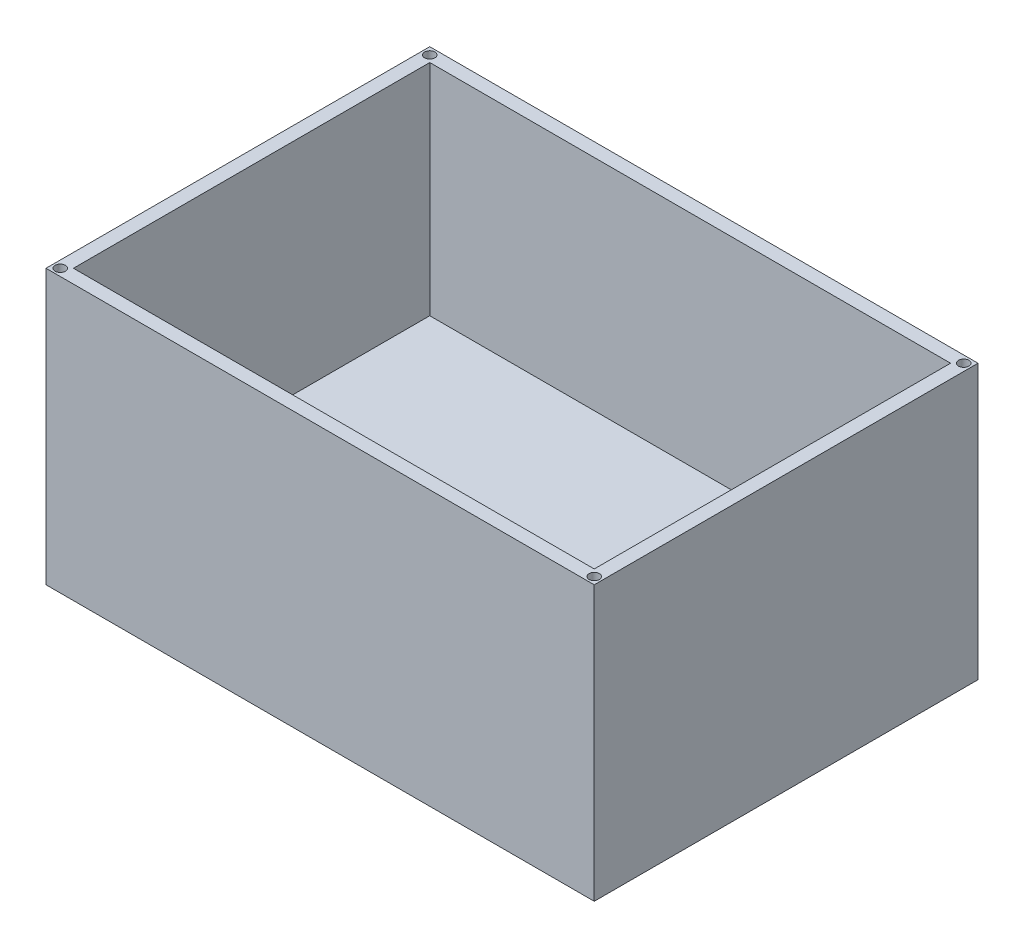
ISO-10303-21;
HEADER;
FILE_DESCRIPTION(('STEP AP214'),'2;1');
FILE_NAME('part.step','',(''),(''),'','','');
FILE_SCHEMA(('AUTOMOTIVE_DESIGN { 1 0 10303 214 1 1 1 1 }'));
ENDSEC;
DATA;
#1=APPLICATION_CONTEXT('core data for automotive mechanical design processes');
#2=APPLICATION_PROTOCOL_DEFINITION('international standard','automotive_design',2000,#1);
#3=PRODUCT_CONTEXT('',#1,'mechanical');
#4=PRODUCT('Part','Part','',(#3));
#5=PRODUCT_RELATED_PRODUCT_CATEGORY('part','',(#4));
#6=PRODUCT_DEFINITION_FORMATION('','',#4);
#7=PRODUCT_DEFINITION_CONTEXT('part definition',#1,'design');
#8=PRODUCT_DEFINITION('design','',#6,#7);
#9=PRODUCT_DEFINITION_SHAPE('','',#8);
#10=(LENGTH_UNIT() NAMED_UNIT(*) SI_UNIT(.MILLI.,.METRE.));
#11=(NAMED_UNIT(*) PLANE_ANGLE_UNIT() SI_UNIT($,.RADIAN.));
#12=(NAMED_UNIT(*) SI_UNIT($,.STERADIAN.) SOLID_ANGLE_UNIT());
#13=UNCERTAINTY_MEASURE_WITH_UNIT(LENGTH_MEASURE(1.E-05),#10,'distance_accuracy_value','');
#14=(GEOMETRIC_REPRESENTATION_CONTEXT(3) GLOBAL_UNCERTAINTY_ASSIGNED_CONTEXT((#13)) GLOBAL_UNIT_ASSIGNED_CONTEXT((#10,
#11,#12)) REPRESENTATION_CONTEXT('',''));
#15=CARTESIAN_POINT('',(0.,0.,0.));
#16=DIRECTION('',(0.,0.,1.));
#17=DIRECTION('',(1.,0.,0.));
#18=AXIS2_PLACEMENT_3D('',#15,#16,#17);
#19=CARTESIAN_POINT('',(127.,127.,88.9));
#20=DIRECTION('',(-1.,0.,0.));
#21=DIRECTION('',(0.,0.,1.));
#22=AXIS2_PLACEMENT_3D('',#19,#20,#21);
#23=PLANE('',#22);
#24=DIRECTION('',(0.,0.,-1.));
#25=VECTOR('',#24,1.);
#26=CARTESIAN_POINT('',(127.,0.,88.9));
#27=LINE('',#26,#25);
#28=CARTESIAN_POINT('',(127.,0.,88.9));
#29=VERTEX_POINT('',#28);
#30=CARTESIAN_POINT('',(127.,0.,-88.9));
#31=VERTEX_POINT('',#30);
#32=EDGE_CURVE('E175',#29,#31,#27,.T.);
#33=ORIENTED_EDGE('',*,*,#32,.T.);
#34=DIRECTION('',(0.,-1.,0.));
#35=VECTOR('',#34,1.);
#36=CARTESIAN_POINT('',(127.,127.,-88.9));
#37=LINE('',#36,#35);
#38=CARTESIAN_POINT('',(127.,127.,-88.9));
#39=VERTEX_POINT('',#38);
#40=EDGE_CURVE('E11',#39,#31,#37,.T.);
#41=ORIENTED_EDGE('',*,*,#40,.F.);
#42=DIRECTION('',(0.,0.,-1.));
#43=VECTOR('',#42,1.);
#44=CARTESIAN_POINT('',(127.,127.,88.9));
#45=LINE('',#44,#43);
#46=CARTESIAN_POINT('',(127.,127.,88.9));
#47=VERTEX_POINT('',#46);
#48=EDGE_CURVE('E181',#47,#39,#45,.T.);
#49=ORIENTED_EDGE('',*,*,#48,.F.);
#50=DIRECTION('',(0.,-1.,0.));
#51=VECTOR('',#50,1.);
#52=CARTESIAN_POINT('',(127.,127.,88.9));
#53=LINE('',#52,#51);
#54=EDGE_CURVE('E187',#47,#29,#53,.T.);
#55=ORIENTED_EDGE('',*,*,#54,.T.);
#56=EDGE_LOOP('',(#33,#41,#49,#55));
#57=FACE_BOUND('',#56,.T.);
#58=ADVANCED_FACE('F32',(#57),#23,.F.);
#59=CARTESIAN_POINT('',(-127.,127.,-88.9));
#60=DIRECTION('',(0.,0.,1.));
#61=DIRECTION('',(1.,0.,0.));
#62=AXIS2_PLACEMENT_3D('',#59,#60,#61);
#63=PLANE('',#62);
#64=CARTESIAN_POINT('',(90.0008618751738,33.4019430578325,-88.9));
#65=DIRECTION('',(0.,0.,1.));
#66=DIRECTION('',(1.,0.,0.));
#67=AXIS2_PLACEMENT_3D('',#64,#65,#66);
#68=CIRCLE('',#67,2.182876);
#69=CARTESIAN_POINT('',(92.1837378751738,33.4019430578325,-88.9));
#70=VERTEX_POINT('',#69);
#71=EDGE_CURVE('E232',#70,#70,#68,.T.);
#72=ORIENTED_EDGE('',*,*,#71,.T.);
#73=EDGE_LOOP('',(#72));
#74=FACE_BOUND('',#73,.T.);
#75=CARTESIAN_POINT('',(90.0008618751738,61.1157938161826,-88.9));
#76=DIRECTION('',(0.,0.,1.));
#77=DIRECTION('',(1.,0.,0.));
#78=AXIS2_PLACEMENT_3D('',#75,#76,#77);
#79=CIRCLE('',#78,2.182876);
#80=CARTESIAN_POINT('',(92.1837378751738,61.1157938161826,-88.9));
#81=VERTEX_POINT('',#80);
#82=EDGE_CURVE('E236',#81,#81,#79,.T.);
#83=ORIENTED_EDGE('',*,*,#82,.T.);
#84=EDGE_LOOP('',(#83));
#85=FACE_BOUND('',#84,.T.);
#86=CARTESIAN_POINT('',(77.5075700515606,52.7356781744935,-88.9));
#87=DIRECTION('',(0.,0.,1.));
#88=DIRECTION('',(1.,0.,0.));
#89=AXIS2_PLACEMENT_3D('',#86,#87,#88);
#90=CIRCLE('',#89,2.182876);
#91=CARTESIAN_POINT('',(79.6904460515606,52.7356781744935,-88.9));
#92=VERTEX_POINT('',#91);
#93=EDGE_CURVE('E240',#92,#92,#90,.T.);
#94=ORIENTED_EDGE('',*,*,#93,.T.);
#95=EDGE_LOOP('',(#94));
#96=FACE_BOUND('',#95,.T.);
#97=CARTESIAN_POINT('',(77.5075700515606,38.8562011424111,-88.9));
#98=DIRECTION('',(0.,0.,1.));
#99=DIRECTION('',(1.,0.,0.));
#100=AXIS2_PLACEMENT_3D('',#97,#98,#99);
#101=CIRCLE('',#100,2.182876);
#102=CARTESIAN_POINT('',(79.6904460515606,38.8562011424111,-88.9));
#103=VERTEX_POINT('',#102);
#104=EDGE_CURVE('E244',#103,#103,#101,.T.);
#105=ORIENTED_EDGE('',*,*,#104,.T.);
#106=EDGE_LOOP('',(#105));
#107=FACE_BOUND('',#106,.T.);
#108=CARTESIAN_POINT('',(103.3568980883,52.7356781744935,-88.9));
#109=DIRECTION('',(0.,0.,1.));
#110=DIRECTION('',(1.,0.,0.));
#111=AXIS2_PLACEMENT_3D('',#108,#109,#110);
#112=CIRCLE('',#111,2.182876);
#113=CARTESIAN_POINT('',(105.5397740883,52.7356781744935,-88.9));
#114=VERTEX_POINT('',#113);
#115=EDGE_CURVE('E248',#114,#114,#112,.T.);
#116=ORIENTED_EDGE('',*,*,#115,.T.);
#117=EDGE_LOOP('',(#116));
#118=FACE_BOUND('',#117,.T.);
#119=CARTESIAN_POINT('',(103.3568980883,38.8562011424111,-88.9));
#120=DIRECTION('',(0.,0.,1.));
#121=DIRECTION('',(1.,0.,0.));
#122=AXIS2_PLACEMENT_3D('',#119,#120,#121);
#123=CIRCLE('',#122,2.182876);
#124=CARTESIAN_POINT('',(105.5397740883,38.8562011424111,-88.9));
#125=VERTEX_POINT('',#124);
#126=EDGE_CURVE('E252',#125,#125,#123,.T.);
#127=ORIENTED_EDGE('',*,*,#126,.T.);
#128=EDGE_LOOP('',(#127));
#129=FACE_BOUND('',#128,.T.);
#130=CARTESIAN_POINT('',(90.0008618751738,46.9778842587211,-88.9));
#131=DIRECTION('',(0.,0.,1.));
#132=DIRECTION('',(1.,0.,0.));
#133=AXIS2_PLACEMENT_3D('',#130,#131,#132);
#134=CIRCLE('',#133,2.182876);
#135=CARTESIAN_POINT('',(92.1837378751738,46.9778842587211,-88.9));
#136=VERTEX_POINT('',#135);
#137=EDGE_CURVE('E132',#136,#136,#134,.T.);
#138=ORIENTED_EDGE('',*,*,#137,.T.);
#139=EDGE_LOOP('',(#138));
#140=FACE_BOUND('',#139,.T.);
#141=DIRECTION('',(-1.,0.,0.));
#142=VECTOR('',#141,1.);
#143=CARTESIAN_POINT('',(-127.,0.,-88.9));
#144=LINE('',#143,#142);
#145=CARTESIAN_POINT('',(-127.,0.,-88.9));
#146=VERTEX_POINT('',#145);
#147=EDGE_CURVE('E190',#31,#146,#144,.T.);
#148=ORIENTED_EDGE('',*,*,#147,.T.);
#149=DIRECTION('',(0.,-1.,0.));
#150=VECTOR('',#149,1.);
#151=CARTESIAN_POINT('',(-127.,127.,-88.9));
#152=LINE('',#151,#150);
#153=CARTESIAN_POINT('',(-127.,127.,-88.9));
#154=VERTEX_POINT('',#153);
#155=EDGE_CURVE('E39',#154,#146,#152,.T.);
#156=ORIENTED_EDGE('',*,*,#155,.F.);
#157=DIRECTION('',(-1.,0.,0.));
#158=VECTOR('',#157,1.);
#159=CARTESIAN_POINT('',(-127.,127.,-88.9));
#160=LINE('',#159,#158);
#161=EDGE_CURVE('E83',#39,#154,#160,.T.);
#162=ORIENTED_EDGE('',*,*,#161,.F.);
#163=ORIENTED_EDGE('',*,*,#40,.T.);
#164=EDGE_LOOP('',(#148,#156,#162,#163));
#165=FACE_BOUND('',#164,.T.);
#166=ADVANCED_FACE('F219',(#74,#85,#96,#107,#118,#129,#140,#165),#63,.F.);
#167=CARTESIAN_POINT('',(-127.,127.,88.9));
#168=DIRECTION('',(1.,0.,0.));
#169=DIRECTION('',(0.,0.,-1.));
#170=AXIS2_PLACEMENT_3D('',#167,#168,#169);
#171=PLANE('',#170);
#172=DIRECTION('',(0.,0.,1.));
#173=VECTOR('',#172,1.);
#174=CARTESIAN_POINT('',(-127.,0.,88.9));
#175=LINE('',#174,#173);
#176=CARTESIAN_POINT('',(-127.,0.,88.9));
#177=VERTEX_POINT('',#176);
#178=EDGE_CURVE('E192',#146,#177,#175,.T.);
#179=ORIENTED_EDGE('',*,*,#178,.T.);
#180=DIRECTION('',(0.,-1.,0.));
#181=VECTOR('',#180,1.);
#182=CARTESIAN_POINT('',(-127.,127.,88.9));
#183=LINE('',#182,#181);
#184=CARTESIAN_POINT('',(-127.,127.,88.9));
#185=VERTEX_POINT('',#184);
#186=EDGE_CURVE('E196',#185,#177,#183,.T.);
#187=ORIENTED_EDGE('',*,*,#186,.F.);
#188=DIRECTION('',(0.,0.,1.));
#189=VECTOR('',#188,1.);
#190=CARTESIAN_POINT('',(-127.,127.,88.9));
#191=LINE('',#190,#189);
#192=EDGE_CURVE('E184',#154,#185,#191,.T.);
#193=ORIENTED_EDGE('',*,*,#192,.F.);
#194=ORIENTED_EDGE('',*,*,#155,.T.);
#195=EDGE_LOOP('',(#179,#187,#193,#194));
#196=FACE_BOUND('',#195,.T.);
#197=ADVANCED_FACE('F201',(#196),#171,.F.);
#198=CARTESIAN_POINT('',(-127.,127.,88.9));
#199=DIRECTION('',(0.,0.,-1.));
#200=DIRECTION('',(-1.,0.,0.));
#201=AXIS2_PLACEMENT_3D('',#198,#199,#200);
#202=PLANE('',#201);
#203=DIRECTION('',(1.,0.,0.));
#204=VECTOR('',#203,1.);
#205=CARTESIAN_POINT('',(-127.,0.,88.9));
#206=LINE('',#205,#204);
#207=EDGE_CURVE('E76',#177,#29,#206,.T.);
#208=ORIENTED_EDGE('',*,*,#207,.T.);
#209=ORIENTED_EDGE('',*,*,#54,.F.);
#210=DIRECTION('',(1.,0.,0.));
#211=VECTOR('',#210,1.);
#212=CARTESIAN_POINT('',(-127.,127.,88.9));
#213=LINE('',#212,#211);
#214=EDGE_CURVE('E55',#185,#47,#213,.T.);
#215=ORIENTED_EDGE('',*,*,#214,.F.);
#216=ORIENTED_EDGE('',*,*,#186,.T.);
#217=EDGE_LOOP('',(#208,#209,#215,#216));
#218=FACE_BOUND('',#217,.T.);
#219=ADVANCED_FACE('F209',(#218),#202,.F.);
#220=CARTESIAN_POINT('',(0.,127.,0.));
#221=DIRECTION('',(0.,-1.,0.));
#222=DIRECTION('',(0.,0.,-1.));
#223=AXIS2_PLACEMENT_3D('',#220,#221,#222);
#224=PLANE('',#223);
#225=CARTESIAN_POINT('',(123.698,127.,85.598));
#226=DIRECTION('',(0.,1.,0.));
#227=DIRECTION('',(0.,0.,1.));
#228=AXIS2_PLACEMENT_3D('',#225,#226,#227);
#229=CIRCLE('',#228,2.38125);
#230=CARTESIAN_POINT('',(123.698,127.,87.97925));
#231=VERTEX_POINT('',#230);
#232=EDGE_CURVE('E126',#231,#231,#229,.T.);
#233=ORIENTED_EDGE('',*,*,#232,.F.);
#234=EDGE_LOOP('',(#233));
#235=FACE_BOUND('',#234,.T.);
#236=CARTESIAN_POINT('',(-123.698,127.,85.598));
#237=DIRECTION('',(0.,1.,0.));
#238=DIRECTION('',(0.,0.,1.));
#239=AXIS2_PLACEMENT_3D('',#236,#237,#238);
#240=CIRCLE('',#239,2.38124999999999);
#241=CARTESIAN_POINT('',(-123.698,127.,87.97925));
#242=VERTEX_POINT('',#241);
#243=EDGE_CURVE('E125',#242,#242,#240,.T.);
#244=ORIENTED_EDGE('',*,*,#243,.F.);
#245=EDGE_LOOP('',(#244));
#246=FACE_BOUND('',#245,.T.);
#247=CARTESIAN_POINT('',(123.698,127.,-85.598));
#248=DIRECTION('',(0.,1.,0.));
#249=DIRECTION('',(0.,0.,1.));
#250=AXIS2_PLACEMENT_3D('',#247,#248,#249);
#251=CIRCLE('',#250,2.38125);
#252=CARTESIAN_POINT('',(123.698,127.,-83.21675));
#253=VERTEX_POINT('',#252);
#254=EDGE_CURVE('E138',#253,#253,#251,.T.);
#255=ORIENTED_EDGE('',*,*,#254,.F.);
#256=EDGE_LOOP('',(#255));
#257=FACE_BOUND('',#256,.T.);
#258=CARTESIAN_POINT('',(-123.698,127.,-85.598));
#259=DIRECTION('',(0.,1.,0.));
#260=DIRECTION('',(0.,0.,1.));
#261=AXIS2_PLACEMENT_3D('',#258,#259,#260);
#262=CIRCLE('',#261,2.38124999999999);
#263=CARTESIAN_POINT('',(-123.698,127.,-83.21675));
#264=VERTEX_POINT('',#263);
#265=EDGE_CURVE('E144',#264,#264,#262,.T.);
#266=ORIENTED_EDGE('',*,*,#265,.F.);
#267=EDGE_LOOP('',(#266));
#268=FACE_BOUND('',#267,.T.);
#269=DIRECTION('',(-1.,0.,0.));
#270=VECTOR('',#269,1.);
#271=CARTESIAN_POINT('',(-120.65,127.,-82.55));
#272=LINE('',#271,#270);
#273=CARTESIAN_POINT('',(120.65,127.,-82.55));
#274=VERTEX_POINT('',#273);
#275=CARTESIAN_POINT('',(-120.65,127.,-82.55));
#276=VERTEX_POINT('',#275);
#277=EDGE_CURVE('E165',#274,#276,#272,.T.);
#278=ORIENTED_EDGE('',*,*,#277,.F.);
#279=DIRECTION('',(0.,0.,-1.));
#280=VECTOR('',#279,1.);
#281=CARTESIAN_POINT('',(120.65,127.,82.55));
#282=LINE('',#281,#280);
#283=CARTESIAN_POINT('',(120.65,127.,82.55));
#284=VERTEX_POINT('',#283);
#285=EDGE_CURVE('E46',#284,#274,#282,.T.);
#286=ORIENTED_EDGE('',*,*,#285,.F.);
#287=DIRECTION('',(1.,0.,0.));
#288=VECTOR('',#287,1.);
#289=CARTESIAN_POINT('',(-120.65,127.,82.55));
#290=LINE('',#289,#288);
#291=CARTESIAN_POINT('',(-120.65,127.,82.55));
#292=VERTEX_POINT('',#291);
#293=EDGE_CURVE('E154',#292,#284,#290,.T.);
#294=ORIENTED_EDGE('',*,*,#293,.F.);
#295=DIRECTION('',(0.,0.,1.));
#296=VECTOR('',#295,1.);
#297=CARTESIAN_POINT('',(-120.65,127.,82.55));
#298=LINE('',#297,#296);
#299=EDGE_CURVE('E168',#276,#292,#298,.T.);
#300=ORIENTED_EDGE('',*,*,#299,.F.);
#301=EDGE_LOOP('',(#278,#286,#294,#300));
#302=FACE_BOUND('',#301,.T.);
#303=ORIENTED_EDGE('',*,*,#48,.T.);
#304=ORIENTED_EDGE('',*,*,#161,.T.);
#305=ORIENTED_EDGE('',*,*,#192,.T.);
#306=ORIENTED_EDGE('',*,*,#214,.T.);
#307=EDGE_LOOP('',(#303,#304,#305,#306));
#308=FACE_BOUND('',#307,.T.);
#309=ADVANCED_FACE('F211',(#235,#246,#257,#268,#302,#308),#224,.F.);
#310=CARTESIAN_POINT('',(0.,0.,0.));
#311=DIRECTION('',(0.,-1.,0.));
#312=DIRECTION('',(0.,0.,-1.));
#313=AXIS2_PLACEMENT_3D('',#310,#311,#312);
#314=PLANE('',#313);
#315=ORIENTED_EDGE('',*,*,#32,.F.);
#316=ORIENTED_EDGE('',*,*,#207,.F.);
#317=ORIENTED_EDGE('',*,*,#178,.F.);
#318=ORIENTED_EDGE('',*,*,#147,.F.);
#319=EDGE_LOOP('',(#315,#316,#317,#318));
#320=FACE_BOUND('',#319,.T.);
#321=ADVANCED_FACE('F205',(#320),#314,.T.);
#322=CARTESIAN_POINT('',(120.65,25.4,82.55));
#323=DIRECTION('',(1.,0.,0.));
#324=DIRECTION('',(0.,0.,-1.));
#325=AXIS2_PLACEMENT_3D('',#322,#323,#324);
#326=PLANE('',#325);
#327=ORIENTED_EDGE('',*,*,#285,.T.);
#328=DIRECTION('',(0.,1.,0.));
#329=VECTOR('',#328,1.);
#330=CARTESIAN_POINT('',(120.65,25.4,-82.55));
#331=LINE('',#330,#329);
#332=CARTESIAN_POINT('',(120.65,25.4,-82.55));
#333=VERTEX_POINT('',#332);
#334=EDGE_CURVE('E163',#333,#274,#331,.T.);
#335=ORIENTED_EDGE('',*,*,#334,.F.);
#336=DIRECTION('',(0.,0.,-1.));
#337=VECTOR('',#336,1.);
#338=CARTESIAN_POINT('',(120.65,25.4,82.55));
#339=LINE('',#338,#337);
#340=CARTESIAN_POINT('',(120.65,25.4,82.55));
#341=VERTEX_POINT('',#340);
#342=EDGE_CURVE('E150',#341,#333,#339,.T.);
#343=ORIENTED_EDGE('',*,*,#342,.F.);
#344=DIRECTION('',(0.,1.,0.));
#345=VECTOR('',#344,1.);
#346=CARTESIAN_POINT('',(120.65,25.4,82.55));
#347=LINE('',#346,#345);
#348=EDGE_CURVE('E173',#341,#284,#347,.T.);
#349=ORIENTED_EDGE('',*,*,#348,.T.);
#350=EDGE_LOOP('',(#327,#335,#343,#349));
#351=FACE_BOUND('',#350,.T.);
#352=ADVANCED_FACE('F315',(#351),#326,.F.);
#353=CARTESIAN_POINT('',(-120.65,25.4,82.55));
#354=DIRECTION('',(0.,0.,1.));
#355=DIRECTION('',(1.,0.,0.));
#356=AXIS2_PLACEMENT_3D('',#353,#354,#355);
#357=PLANE('',#356);
#358=ORIENTED_EDGE('',*,*,#293,.T.);
#359=ORIENTED_EDGE('',*,*,#348,.F.);
#360=DIRECTION('',(1.,0.,0.));
#361=VECTOR('',#360,1.);
#362=CARTESIAN_POINT('',(-120.65,25.4,82.55));
#363=LINE('',#362,#361);
#364=CARTESIAN_POINT('',(-120.65,25.4,82.55));
#365=VERTEX_POINT('',#364);
#366=EDGE_CURVE('E160',#365,#341,#363,.T.);
#367=ORIENTED_EDGE('',*,*,#366,.F.);
#368=DIRECTION('',(0.,1.,0.));
#369=VECTOR('',#368,1.);
#370=CARTESIAN_POINT('',(-120.65,25.4,82.55));
#371=LINE('',#370,#369);
#372=EDGE_CURVE('E176',#365,#292,#371,.T.);
#373=ORIENTED_EDGE('',*,*,#372,.T.);
#374=EDGE_LOOP('',(#358,#359,#367,#373));
#375=FACE_BOUND('',#374,.T.);
#376=ADVANCED_FACE('F317',(#375),#357,.F.);
#377=CARTESIAN_POINT('',(-120.65,25.4,82.55));
#378=DIRECTION('',(-1.,0.,0.));
#379=DIRECTION('',(0.,0.,1.));
#380=AXIS2_PLACEMENT_3D('',#377,#378,#379);
#381=PLANE('',#380);
#382=ORIENTED_EDGE('',*,*,#299,.T.);
#383=ORIENTED_EDGE('',*,*,#372,.F.);
#384=DIRECTION('',(0.,0.,1.));
#385=VECTOR('',#384,1.);
#386=CARTESIAN_POINT('',(-120.65,25.4,82.55));
#387=LINE('',#386,#385);
#388=CARTESIAN_POINT('',(-120.65,25.4,-82.55));
#389=VERTEX_POINT('',#388);
#390=EDGE_CURVE('E157',#389,#365,#387,.T.);
#391=ORIENTED_EDGE('',*,*,#390,.F.);
#392=DIRECTION('',(0.,1.,0.));
#393=VECTOR('',#392,1.);
#394=CARTESIAN_POINT('',(-120.65,25.4,-82.55));
#395=LINE('',#394,#393);
#396=EDGE_CURVE('E178',#389,#276,#395,.T.);
#397=ORIENTED_EDGE('',*,*,#396,.T.);
#398=EDGE_LOOP('',(#382,#383,#391,#397));
#399=FACE_BOUND('',#398,.T.);
#400=ADVANCED_FACE('F291',(#399),#381,.F.);
#401=CARTESIAN_POINT('',(-120.65,25.4,-82.55));
#402=DIRECTION('',(0.,0.,-1.));
#403=DIRECTION('',(-1.,0.,0.));
#404=AXIS2_PLACEMENT_3D('',#401,#402,#403);
#405=PLANE('',#404);
#406=CARTESIAN_POINT('',(90.0008618751738,33.4019430578325,-82.55));
#407=DIRECTION('',(0.,0.,1.));
#408=DIRECTION('',(1.,0.,0.));
#409=AXIS2_PLACEMENT_3D('',#406,#407,#408);
#410=CIRCLE('',#409,2.18287599999999);
#411=CARTESIAN_POINT('',(92.1837378751738,33.4019430578325,-82.55));
#412=VERTEX_POINT('',#411);
#413=EDGE_CURVE('E281',#412,#412,#410,.T.);
#414=ORIENTED_EDGE('',*,*,#413,.F.);
#415=EDGE_LOOP('',(#414));
#416=FACE_BOUND('',#415,.T.);
#417=CARTESIAN_POINT('',(90.0008618751738,61.1157938161826,-82.55));
#418=DIRECTION('',(0.,0.,1.));
#419=DIRECTION('',(1.,0.,0.));
#420=AXIS2_PLACEMENT_3D('',#417,#418,#419);
#421=CIRCLE('',#420,2.18287599999999);
#422=CARTESIAN_POINT('',(92.1837378751738,61.1157938161826,-82.55));
#423=VERTEX_POINT('',#422);
#424=EDGE_CURVE('E277',#423,#423,#421,.T.);
#425=ORIENTED_EDGE('',*,*,#424,.F.);
#426=EDGE_LOOP('',(#425));
#427=FACE_BOUND('',#426,.T.);
#428=CARTESIAN_POINT('',(77.5075700515606,52.7356781744935,-82.55));
#429=DIRECTION('',(0.,0.,1.));
#430=DIRECTION('',(1.,0.,0.));
#431=AXIS2_PLACEMENT_3D('',#428,#429,#430);
#432=CIRCLE('',#431,2.18287599999999);
#433=CARTESIAN_POINT('',(79.6904460515605,52.7356781744935,-82.55));
#434=VERTEX_POINT('',#433);
#435=EDGE_CURVE('E273',#434,#434,#432,.T.);
#436=ORIENTED_EDGE('',*,*,#435,.F.);
#437=EDGE_LOOP('',(#436));
#438=FACE_BOUND('',#437,.T.);
#439=CARTESIAN_POINT('',(77.5075700515606,38.8562011424111,-82.55));
#440=DIRECTION('',(0.,0.,1.));
#441=DIRECTION('',(1.,0.,0.));
#442=AXIS2_PLACEMENT_3D('',#439,#440,#441);
#443=CIRCLE('',#442,2.18287599999999);
#444=CARTESIAN_POINT('',(79.6904460515605,38.8562011424111,-82.55));
#445=VERTEX_POINT('',#444);
#446=EDGE_CURVE('E269',#445,#445,#443,.T.);
#447=ORIENTED_EDGE('',*,*,#446,.F.);
#448=EDGE_LOOP('',(#447));
#449=FACE_BOUND('',#448,.T.);
#450=CARTESIAN_POINT('',(103.3568980883,52.7356781744935,-82.55));
#451=DIRECTION('',(0.,0.,1.));
#452=DIRECTION('',(1.,0.,0.));
#453=AXIS2_PLACEMENT_3D('',#450,#451,#452);
#454=CIRCLE('',#453,2.18287599999999);
#455=CARTESIAN_POINT('',(105.5397740883,52.7356781744935,-82.55));
#456=VERTEX_POINT('',#455);
#457=EDGE_CURVE('E265',#456,#456,#454,.T.);
#458=ORIENTED_EDGE('',*,*,#457,.F.);
#459=EDGE_LOOP('',(#458));
#460=FACE_BOUND('',#459,.T.);
#461=CARTESIAN_POINT('',(103.3568980883,38.8562011424111,-82.55));
#462=DIRECTION('',(0.,0.,1.));
#463=DIRECTION('',(1.,0.,0.));
#464=AXIS2_PLACEMENT_3D('',#461,#462,#463);
#465=CIRCLE('',#464,2.18287599999999);
#466=CARTESIAN_POINT('',(105.5397740883,38.8562011424111,-82.55));
#467=VERTEX_POINT('',#466);
#468=EDGE_CURVE('E261',#467,#467,#465,.T.);
#469=ORIENTED_EDGE('',*,*,#468,.F.);
#470=EDGE_LOOP('',(#469));
#471=FACE_BOUND('',#470,.T.);
#472=CARTESIAN_POINT('',(90.0008618751738,46.9778842587211,-82.55));
#473=DIRECTION('',(0.,0.,1.));
#474=DIRECTION('',(1.,0.,0.));
#475=AXIS2_PLACEMENT_3D('',#472,#473,#474);
#476=CIRCLE('',#475,2.18287599999999);
#477=CARTESIAN_POINT('',(92.1837378751738,46.9778842587211,-82.55));
#478=VERTEX_POINT('',#477);
#479=EDGE_CURVE('E256',#478,#478,#476,.T.);
#480=ORIENTED_EDGE('',*,*,#479,.F.);
#481=EDGE_LOOP('',(#480));
#482=FACE_BOUND('',#481,.T.);
#483=ORIENTED_EDGE('',*,*,#277,.T.);
#484=ORIENTED_EDGE('',*,*,#396,.F.);
#485=DIRECTION('',(-1.,0.,0.));
#486=VECTOR('',#485,1.);
#487=CARTESIAN_POINT('',(-120.65,25.4,-82.55));
#488=LINE('',#487,#486);
#489=EDGE_CURVE('E153',#333,#389,#488,.T.);
#490=ORIENTED_EDGE('',*,*,#489,.F.);
#491=ORIENTED_EDGE('',*,*,#334,.T.);
#492=EDGE_LOOP('',(#483,#484,#490,#491));
#493=FACE_BOUND('',#492,.T.);
#494=ADVANCED_FACE('F287',(#416,#427,#438,#449,#460,#471,#482,#493),#405,.F.);
#495=CARTESIAN_POINT('',(0.,25.4,0.));
#496=DIRECTION('',(0.,-1.,0.));
#497=DIRECTION('',(0.,0.,-1.));
#498=AXIS2_PLACEMENT_3D('',#495,#496,#497);
#499=PLANE('',#498);
#500=ORIENTED_EDGE('',*,*,#342,.T.);
#501=ORIENTED_EDGE('',*,*,#489,.T.);
#502=ORIENTED_EDGE('',*,*,#390,.T.);
#503=ORIENTED_EDGE('',*,*,#366,.T.);
#504=EDGE_LOOP('',(#500,#501,#502,#503));
#505=FACE_BOUND('',#504,.T.);
#506=ADVANCED_FACE('F290',(#505),#499,.F.);
#507=CARTESIAN_POINT('',(-123.698,114.3,-85.598));
#508=DIRECTION('',(0.,1.,0.));
#509=DIRECTION('',(0.,0.,1.));
#510=AXIS2_PLACEMENT_3D('',#507,#508,#509);
#511=CONICAL_SURFACE('',#510,2.38124999999999,1.02974425867665);
#512=CARTESIAN_POINT('',(-123.698,112.869200650941,-85.598));
#513=VERTEX_POINT('',#512);
#514=VERTEX_LOOP('',#513);
#515=FACE_BOUND('',#514,.T.);
#516=CARTESIAN_POINT('',(-123.698,114.3,-85.598));
#517=DIRECTION('',(0.,1.,0.));
#518=DIRECTION('',(0.,0.,1.));
#519=AXIS2_PLACEMENT_3D('',#516,#517,#518);
#520=CIRCLE('',#519,2.38124999999999);
#521=CARTESIAN_POINT('',(-123.698,114.3,-83.21675));
#522=VERTEX_POINT('',#521);
#523=EDGE_CURVE('E147',#522,#522,#520,.T.);
#524=ORIENTED_EDGE('',*,*,#523,.T.);
#525=EDGE_LOOP('',(#524));
#526=FACE_BOUND('',#525,.T.);
#527=ADVANCED_FACE('F357',(#515,#526),#511,.F.);
#528=CARTESIAN_POINT('',(-123.698,127.,-85.598));
#529=DIRECTION('',(0.,1.,0.));
#530=DIRECTION('',(0.,0.,1.));
#531=AXIS2_PLACEMENT_3D('',#528,#529,#530);
#532=CYLINDRICAL_SURFACE('',#531,2.38124999999999);
#533=ORIENTED_EDGE('',*,*,#523,.F.);
#534=EDGE_LOOP('',(#533));
#535=FACE_BOUND('',#534,.T.);
#536=ORIENTED_EDGE('',*,*,#265,.T.);
#537=EDGE_LOOP('',(#536));
#538=FACE_BOUND('',#537,.T.);
#539=ADVANCED_FACE('F365',(#535,#538),#532,.F.);
#540=CARTESIAN_POINT('',(123.698,114.3,-85.598));
#541=DIRECTION('',(0.,1.,0.));
#542=DIRECTION('',(0.,0.,1.));
#543=AXIS2_PLACEMENT_3D('',#540,#541,#542);
#544=CONICAL_SURFACE('',#543,2.38124999999997,1.02974425867665);
#545=CARTESIAN_POINT('',(123.698,112.869200650941,-85.598));
#546=VERTEX_POINT('',#545);
#547=VERTEX_LOOP('',#546);
#548=FACE_BOUND('',#547,.T.);
#549=CARTESIAN_POINT('',(123.698,114.3,-85.598));
#550=DIRECTION('',(0.,1.,0.));
#551=DIRECTION('',(0.,0.,1.));
#552=AXIS2_PLACEMENT_3D('',#549,#550,#551);
#553=CIRCLE('',#552,2.38124999999997);
#554=CARTESIAN_POINT('',(123.698,114.3,-83.21675));
#555=VERTEX_POINT('',#554);
#556=EDGE_CURVE('E141',#555,#555,#553,.T.);
#557=ORIENTED_EDGE('',*,*,#556,.T.);
#558=EDGE_LOOP('',(#557));
#559=FACE_BOUND('',#558,.T.);
#560=ADVANCED_FACE('F374',(#548,#559),#544,.F.);
#561=CARTESIAN_POINT('',(123.698,127.,-85.598));
#562=DIRECTION('',(0.,1.,0.));
#563=DIRECTION('',(0.,0.,1.));
#564=AXIS2_PLACEMENT_3D('',#561,#562,#563);
#565=CYLINDRICAL_SURFACE('',#564,2.38124999999999);
#566=ORIENTED_EDGE('',*,*,#556,.F.);
#567=EDGE_LOOP('',(#566));
#568=FACE_BOUND('',#567,.T.);
#569=ORIENTED_EDGE('',*,*,#254,.T.);
#570=EDGE_LOOP('',(#569));
#571=FACE_BOUND('',#570,.T.);
#572=ADVANCED_FACE('F384',(#568,#571),#565,.F.);
#573=CARTESIAN_POINT('',(-123.698,114.3,85.598));
#574=DIRECTION('',(0.,1.,0.));
#575=DIRECTION('',(0.,0.,1.));
#576=AXIS2_PLACEMENT_3D('',#573,#574,#575);
#577=CONICAL_SURFACE('',#576,2.38124999999999,1.02974425867665);
#578=CARTESIAN_POINT('',(-123.698,112.869200650941,85.598));
#579=VERTEX_POINT('',#578);
#580=VERTEX_LOOP('',#579);
#581=FACE_BOUND('',#580,.T.);
#582=CARTESIAN_POINT('',(-123.698,114.3,85.598));
#583=DIRECTION('',(0.,1.,0.));
#584=DIRECTION('',(0.,0.,1.));
#585=AXIS2_PLACEMENT_3D('',#582,#583,#584);
#586=CIRCLE('',#585,2.38124999999999);
#587=CARTESIAN_POINT('',(-123.698,114.3,87.97925));
#588=VERTEX_POINT('',#587);
#589=EDGE_CURVE('E129',#588,#588,#586,.T.);
#590=ORIENTED_EDGE('',*,*,#589,.T.);
#591=EDGE_LOOP('',(#590));
#592=FACE_BOUND('',#591,.T.);
#593=ADVANCED_FACE('F394',(#581,#592),#577,.F.);
#594=CARTESIAN_POINT('',(-123.698,127.,85.598));
#595=DIRECTION('',(0.,1.,0.));
#596=DIRECTION('',(0.,0.,1.));
#597=AXIS2_PLACEMENT_3D('',#594,#595,#596);
#598=CYLINDRICAL_SURFACE('',#597,2.38124999999999);
#599=ORIENTED_EDGE('',*,*,#589,.F.);
#600=EDGE_LOOP('',(#599));
#601=FACE_BOUND('',#600,.T.);
#602=ORIENTED_EDGE('',*,*,#243,.T.);
#603=EDGE_LOOP('',(#602));
#604=FACE_BOUND('',#603,.T.);
#605=ADVANCED_FACE('F119',(#601,#604),#598,.F.);
#606=CARTESIAN_POINT('',(123.698,114.3,85.598));
#607=DIRECTION('',(0.,1.,0.));
#608=DIRECTION('',(0.,0.,1.));
#609=AXIS2_PLACEMENT_3D('',#606,#607,#608);
#610=CONICAL_SURFACE('',#609,2.38125,1.02974425867666);
#611=CARTESIAN_POINT('',(123.698,112.869200650941,85.598));
#612=VERTEX_POINT('',#611);
#613=VERTEX_LOOP('',#612);
#614=FACE_BOUND('',#613,.T.);
#615=CARTESIAN_POINT('',(123.698,114.3,85.598));
#616=DIRECTION('',(0.,1.,0.));
#617=DIRECTION('',(0.,0.,1.));
#618=AXIS2_PLACEMENT_3D('',#615,#616,#617);
#619=CIRCLE('',#618,2.38125);
#620=CARTESIAN_POINT('',(123.698,114.3,87.97925));
#621=VERTEX_POINT('',#620);
#622=EDGE_CURVE('E123',#621,#621,#619,.T.);
#623=ORIENTED_EDGE('',*,*,#622,.T.);
#624=EDGE_LOOP('',(#623));
#625=FACE_BOUND('',#624,.T.);
#626=ADVANCED_FACE('F115',(#614,#625),#610,.F.);
#627=CARTESIAN_POINT('',(123.698,127.,85.598));
#628=DIRECTION('',(0.,1.,0.));
#629=DIRECTION('',(0.,0.,1.));
#630=AXIS2_PLACEMENT_3D('',#627,#628,#629);
#631=CYLINDRICAL_SURFACE('',#630,2.38125);
#632=ORIENTED_EDGE('',*,*,#622,.F.);
#633=EDGE_LOOP('',(#632));
#634=FACE_BOUND('',#633,.T.);
#635=ORIENTED_EDGE('',*,*,#232,.T.);
#636=EDGE_LOOP('',(#635));
#637=FACE_BOUND('',#636,.T.);
#638=ADVANCED_FACE('F118',(#634,#637),#631,.F.);
#639=CARTESIAN_POINT('',(90.0008618751738,46.9778842587211,-82.55));
#640=DIRECTION('',(0.,0.,1.));
#641=DIRECTION('',(1.,0.,0.));
#642=AXIS2_PLACEMENT_3D('',#639,#640,#641);
#643=CYLINDRICAL_SURFACE('',#642,2.18287599999999);
#644=ORIENTED_EDGE('',*,*,#137,.F.);
#645=EDGE_LOOP('',(#644));
#646=FACE_BOUND('',#645,.T.);
#647=ORIENTED_EDGE('',*,*,#479,.T.);
#648=EDGE_LOOP('',(#647));
#649=FACE_BOUND('',#648,.T.);
#650=ADVANCED_FACE('F432',(#646,#649),#643,.F.);
#651=CARTESIAN_POINT('',(103.3568980883,38.8562011424111,-82.55));
#652=DIRECTION('',(0.,0.,1.));
#653=DIRECTION('',(1.,0.,0.));
#654=AXIS2_PLACEMENT_3D('',#651,#652,#653);
#655=CYLINDRICAL_SURFACE('',#654,2.18287599999999);
#656=ORIENTED_EDGE('',*,*,#126,.F.);
#657=EDGE_LOOP('',(#656));
#658=FACE_BOUND('',#657,.T.);
#659=ORIENTED_EDGE('',*,*,#468,.T.);
#660=EDGE_LOOP('',(#659));
#661=FACE_BOUND('',#660,.T.);
#662=ADVANCED_FACE('F453',(#658,#661),#655,.F.);
#663=CARTESIAN_POINT('',(103.3568980883,52.7356781744935,-82.55));
#664=DIRECTION('',(0.,0.,1.));
#665=DIRECTION('',(1.,0.,0.));
#666=AXIS2_PLACEMENT_3D('',#663,#664,#665);
#667=CYLINDRICAL_SURFACE('',#666,2.18287599999999);
#668=ORIENTED_EDGE('',*,*,#115,.F.);
#669=EDGE_LOOP('',(#668));
#670=FACE_BOUND('',#669,.T.);
#671=ORIENTED_EDGE('',*,*,#457,.T.);
#672=EDGE_LOOP('',(#671));
#673=FACE_BOUND('',#672,.T.);
#674=ADVANCED_FACE('F462',(#670,#673),#667,.F.);
#675=CARTESIAN_POINT('',(77.5075700515606,38.8562011424111,-82.55));
#676=DIRECTION('',(0.,0.,1.));
#677=DIRECTION('',(1.,0.,0.));
#678=AXIS2_PLACEMENT_3D('',#675,#676,#677);
#679=CYLINDRICAL_SURFACE('',#678,2.18287599999999);
#680=ORIENTED_EDGE('',*,*,#104,.F.);
#681=EDGE_LOOP('',(#680));
#682=FACE_BOUND('',#681,.T.);
#683=ORIENTED_EDGE('',*,*,#446,.T.);
#684=EDGE_LOOP('',(#683));
#685=FACE_BOUND('',#684,.T.);
#686=ADVANCED_FACE('F472',(#682,#685),#679,.F.);
#687=CARTESIAN_POINT('',(77.5075700515606,52.7356781744935,-82.55));
#688=DIRECTION('',(0.,0.,1.));
#689=DIRECTION('',(1.,0.,0.));
#690=AXIS2_PLACEMENT_3D('',#687,#688,#689);
#691=CYLINDRICAL_SURFACE('',#690,2.18287599999999);
#692=ORIENTED_EDGE('',*,*,#93,.F.);
#693=EDGE_LOOP('',(#692));
#694=FACE_BOUND('',#693,.T.);
#695=ORIENTED_EDGE('',*,*,#435,.T.);
#696=EDGE_LOOP('',(#695));
#697=FACE_BOUND('',#696,.T.);
#698=ADVANCED_FACE('F482',(#694,#697),#691,.F.);
#699=CARTESIAN_POINT('',(90.0008618751738,61.1157938161826,-82.55));
#700=DIRECTION('',(0.,0.,1.));
#701=DIRECTION('',(1.,0.,0.));
#702=AXIS2_PLACEMENT_3D('',#699,#700,#701);
#703=CYLINDRICAL_SURFACE('',#702,2.18287599999999);
#704=ORIENTED_EDGE('',*,*,#82,.F.);
#705=EDGE_LOOP('',(#704));
#706=FACE_BOUND('',#705,.T.);
#707=ORIENTED_EDGE('',*,*,#424,.T.);
#708=EDGE_LOOP('',(#707));
#709=FACE_BOUND('',#708,.T.);
#710=ADVANCED_FACE('F492',(#706,#709),#703,.F.);
#711=CARTESIAN_POINT('',(90.0008618751738,33.4019430578325,-82.55));
#712=DIRECTION('',(0.,0.,1.));
#713=DIRECTION('',(1.,0.,0.));
#714=AXIS2_PLACEMENT_3D('',#711,#712,#713);
#715=CYLINDRICAL_SURFACE('',#714,2.18287599999999);
#716=ORIENTED_EDGE('',*,*,#71,.F.);
#717=EDGE_LOOP('',(#716));
#718=FACE_BOUND('',#717,.T.);
#719=ORIENTED_EDGE('',*,*,#413,.T.);
#720=EDGE_LOOP('',(#719));
#721=FACE_BOUND('',#720,.T.);
#722=ADVANCED_FACE('F285',(#718,#721),#715,.F.);
#723=CLOSED_SHELL('',(#58,#166,#197,#219,#309,#321,#352,#376,#400,#494,#506,#527,#539,#560,#572,
#593,#605,#626,#638,#650,#662,#674,#686,#698,#710,#722));
#724=MANIFOLD_SOLID_BREP('B2',#723);
#725=ADVANCED_BREP_SHAPE_REPRESENTATION('',(#18,#724),#14);
#726=SHAPE_DEFINITION_REPRESENTATION(#9,#725);
ENDSEC;
END-ISO-10303-21;
